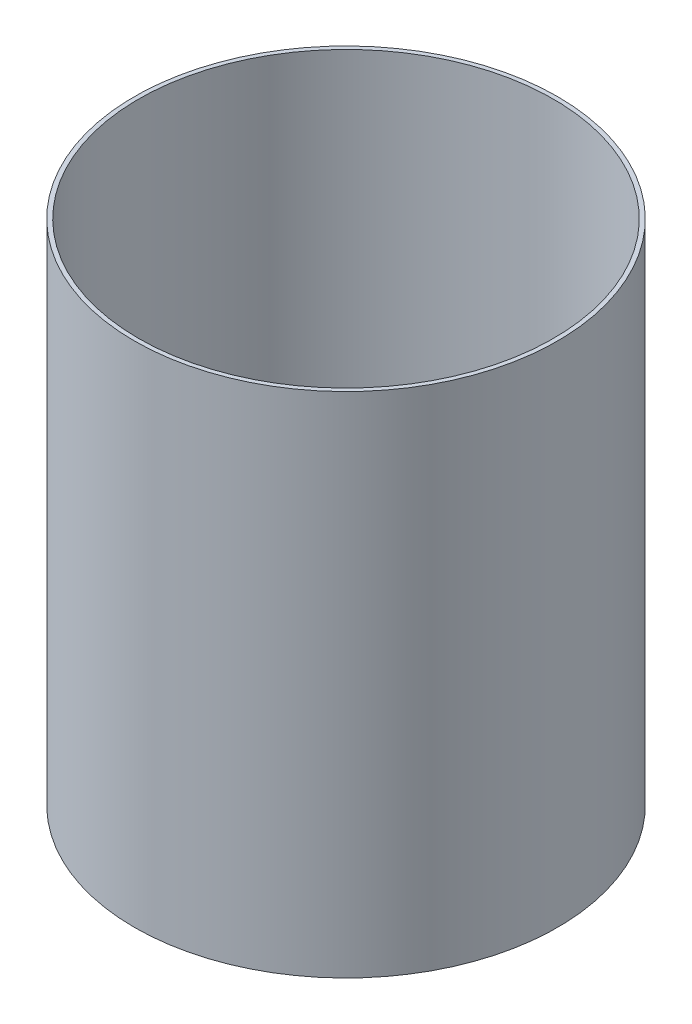
ISO-10303-21;
HEADER;
FILE_DESCRIPTION(('STEP AP214'),'2;1');
FILE_NAME('part.step','',(''),(''),'','','');
FILE_SCHEMA(('AUTOMOTIVE_DESIGN { 1 0 10303 214 1 1 1 1 }'));
ENDSEC;
DATA;
#1=APPLICATION_CONTEXT('core data for automotive mechanical design processes');
#2=APPLICATION_PROTOCOL_DEFINITION('international standard','automotive_design',2000,#1);
#3=PRODUCT_CONTEXT('',#1,'mechanical');
#4=PRODUCT('Part','Part','',(#3));
#5=PRODUCT_RELATED_PRODUCT_CATEGORY('part','',(#4));
#6=PRODUCT_DEFINITION_FORMATION('','',#4);
#7=PRODUCT_DEFINITION_CONTEXT('part definition',#1,'design');
#8=PRODUCT_DEFINITION('design','',#6,#7);
#9=PRODUCT_DEFINITION_SHAPE('','',#8);
#10=(LENGTH_UNIT() NAMED_UNIT(*) SI_UNIT(.MILLI.,.METRE.));
#11=(NAMED_UNIT(*) PLANE_ANGLE_UNIT() SI_UNIT($,.RADIAN.));
#12=(NAMED_UNIT(*) SI_UNIT($,.STERADIAN.) SOLID_ANGLE_UNIT());
#13=UNCERTAINTY_MEASURE_WITH_UNIT(LENGTH_MEASURE(1.E-05),#10,'distance_accuracy_value','');
#14=(GEOMETRIC_REPRESENTATION_CONTEXT(3) GLOBAL_UNCERTAINTY_ASSIGNED_CONTEXT((#13)) GLOBAL_UNIT_ASSIGNED_CONTEXT((#10,
#11,#12)) REPRESENTATION_CONTEXT('',''));
#15=CARTESIAN_POINT('',(0.,0.,0.));
#16=DIRECTION('',(0.,0.,1.));
#17=DIRECTION('',(1.,0.,0.));
#18=AXIS2_PLACEMENT_3D('',#15,#16,#17);
#19=CARTESIAN_POINT('',(0.,240.,0.));
#20=DIRECTION('',(0.,1.,0.));
#21=DIRECTION('',(0.,0.,1.));
#22=AXIS2_PLACEMENT_3D('',#19,#20,#21);
#23=PLANE('',#22);
#24=CARTESIAN_POINT('',(0.,240.,0.));
#25=DIRECTION('',(0.,1.,0.));
#26=DIRECTION('',(0.,0.,1.));
#27=AXIS2_PLACEMENT_3D('',#24,#25,#26);
#28=CIRCLE('',#27,100.);
#29=CARTESIAN_POINT('',(0.,240.,100.));
#30=VERTEX_POINT('',#29);
#31=EDGE_CURVE('E10',#30,#30,#28,.T.);
#32=ORIENTED_EDGE('',*,*,#31,.T.);
#33=EDGE_LOOP('',(#32));
#34=FACE_BOUND('',#33,.T.);
#35=CARTESIAN_POINT('',(0.,240.,0.));
#36=DIRECTION('',(0.,1.,0.));
#37=DIRECTION('',(0.,0.,1.));
#38=AXIS2_PLACEMENT_3D('',#35,#36,#37);
#39=CIRCLE('',#38,98.);
#40=CARTESIAN_POINT('',(0.,240.,98.));
#41=VERTEX_POINT('',#40);
#42=EDGE_CURVE('E46',#41,#41,#39,.T.);
#43=ORIENTED_EDGE('',*,*,#42,.F.);
#44=EDGE_LOOP('',(#43));
#45=FACE_BOUND('',#44,.T.);
#46=ADVANCED_FACE('F35',(#34,#45),#23,.T.);
#47=CARTESIAN_POINT('',(0.,0.,0.));
#48=DIRECTION('',(0.,1.,0.));
#49=DIRECTION('',(0.,0.,1.));
#50=AXIS2_PLACEMENT_3D('',#47,#48,#49);
#51=PLANE('',#50);
#52=CARTESIAN_POINT('',(0.,0.,0.));
#53=DIRECTION('',(0.,1.,0.));
#54=DIRECTION('',(0.,0.,1.));
#55=AXIS2_PLACEMENT_3D('',#52,#53,#54);
#56=CIRCLE('',#55,100.);
#57=CARTESIAN_POINT('',(0.,0.,100.));
#58=VERTEX_POINT('',#57);
#59=EDGE_CURVE('E39',#58,#58,#56,.T.);
#60=ORIENTED_EDGE('',*,*,#59,.F.);
#61=EDGE_LOOP('',(#60));
#62=FACE_BOUND('',#61,.T.);
#63=CARTESIAN_POINT('',(0.,0.,0.));
#64=DIRECTION('',(0.,1.,0.));
#65=DIRECTION('',(0.,0.,1.));
#66=AXIS2_PLACEMENT_3D('',#63,#64,#65);
#67=CIRCLE('',#66,98.);
#68=CARTESIAN_POINT('',(0.,0.,98.));
#69=VERTEX_POINT('',#68);
#70=EDGE_CURVE('E48',#69,#69,#67,.T.);
#71=ORIENTED_EDGE('',*,*,#70,.T.);
#72=EDGE_LOOP('',(#71));
#73=FACE_BOUND('',#72,.T.);
#74=ADVANCED_FACE('F58',(#62,#73),#51,.F.);
#75=CARTESIAN_POINT('',(0.,240.,0.));
#76=DIRECTION('',(0.,-1.,0.));
#77=DIRECTION('',(0.,0.,-1.));
#78=AXIS2_PLACEMENT_3D('',#75,#76,#77);
#79=CYLINDRICAL_SURFACE('',#78,100.);
#80=ORIENTED_EDGE('',*,*,#31,.F.);
#81=EDGE_LOOP('',(#80));
#82=FACE_BOUND('',#81,.T.);
#83=ORIENTED_EDGE('',*,*,#59,.T.);
#84=EDGE_LOOP('',(#83));
#85=FACE_BOUND('',#84,.T.);
#86=ADVANCED_FACE('F37',(#82,#85),#79,.T.);
#87=CARTESIAN_POINT('',(0.,240.,0.));
#88=DIRECTION('',(0.,-1.,0.));
#89=DIRECTION('',(0.,0.,-1.));
#90=AXIS2_PLACEMENT_3D('',#87,#88,#89);
#91=CYLINDRICAL_SURFACE('',#90,98.);
#92=ORIENTED_EDGE('',*,*,#42,.T.);
#93=EDGE_LOOP('',(#92));
#94=FACE_BOUND('',#93,.T.);
#95=ORIENTED_EDGE('',*,*,#70,.F.);
#96=EDGE_LOOP('',(#95));
#97=FACE_BOUND('',#96,.T.);
#98=ADVANCED_FACE('F54',(#94,#97),#91,.F.);
#99=CLOSED_SHELL('',(#46,#74,#86,#98));
#100=MANIFOLD_SOLID_BREP('B2',#99);
#101=ADVANCED_BREP_SHAPE_REPRESENTATION('',(#18,#100),#14);
#102=SHAPE_DEFINITION_REPRESENTATION(#9,#101);
ENDSEC;
END-ISO-10303-21;
